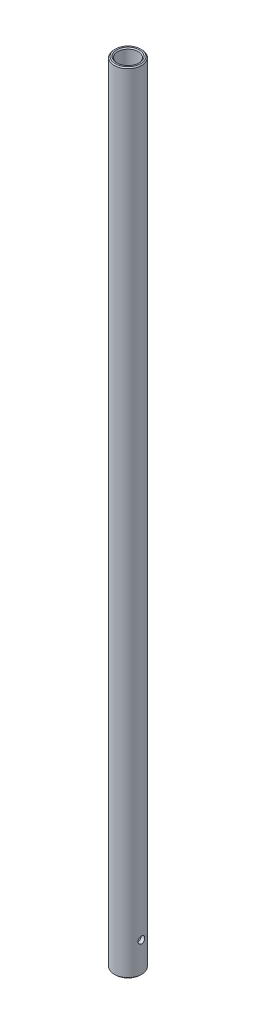
ISO-10303-21;
HEADER;
FILE_DESCRIPTION(('STEP AP214'),'2;1');
FILE_NAME('part.step','',(''),(''),'','','');
FILE_SCHEMA(('AUTOMOTIVE_DESIGN { 1 0 10303 214 1 1 1 1 }'));
ENDSEC;
DATA;
#1=APPLICATION_CONTEXT('core data for automotive mechanical design processes');
#2=APPLICATION_PROTOCOL_DEFINITION('international standard','automotive_design',2000,#1);
#3=PRODUCT_CONTEXT('',#1,'mechanical');
#4=PRODUCT('Part','Part','',(#3));
#5=PRODUCT_RELATED_PRODUCT_CATEGORY('part','',(#4));
#6=PRODUCT_DEFINITION_FORMATION('','',#4);
#7=PRODUCT_DEFINITION_CONTEXT('part definition',#1,'design');
#8=PRODUCT_DEFINITION('design','',#6,#7);
#9=PRODUCT_DEFINITION_SHAPE('','',#8);
#10=(LENGTH_UNIT() NAMED_UNIT(*) SI_UNIT(.MILLI.,.METRE.));
#11=(NAMED_UNIT(*) PLANE_ANGLE_UNIT() SI_UNIT($,.RADIAN.));
#12=(NAMED_UNIT(*) SI_UNIT($,.STERADIAN.) SOLID_ANGLE_UNIT());
#13=UNCERTAINTY_MEASURE_WITH_UNIT(LENGTH_MEASURE(1.E-05),#10,'distance_accuracy_value','');
#14=(GEOMETRIC_REPRESENTATION_CONTEXT(3) GLOBAL_UNCERTAINTY_ASSIGNED_CONTEXT((#13)) GLOBAL_UNIT_ASSIGNED_CONTEXT((#10,
#11,#12)) REPRESENTATION_CONTEXT('',''));
#15=CARTESIAN_POINT('',(0.,0.,0.));
#16=DIRECTION('',(0.,0.,1.));
#17=DIRECTION('',(1.,0.,0.));
#18=AXIS2_PLACEMENT_3D('',#15,#16,#17);
#19=CARTESIAN_POINT('',(0.,230.,0.));
#20=DIRECTION('',(0.,1.,0.));
#21=DIRECTION('',(0.,0.,1.));
#22=AXIS2_PLACEMENT_3D('',#19,#20,#21);
#23=PLANE('',#22);
#24=CARTESIAN_POINT('',(0.,230.,0.));
#25=DIRECTION('',(0.,1.,0.));
#26=DIRECTION('',(0.,0.,1.));
#27=AXIS2_PLACEMENT_3D('',#24,#25,#26);
#28=CIRCLE('',#27,3.29999999999997);
#29=CARTESIAN_POINT('',(0.,230.,3.29999999999997));
#30=VERTEX_POINT('',#29);
#31=EDGE_CURVE('E132',#30,#30,#28,.F.);
#32=ORIENTED_EDGE('',*,*,#31,.T.);
#33=EDGE_LOOP('',(#32));
#34=FACE_BOUND('',#33,.T.);
#35=CARTESIAN_POINT('',(0.,230.,0.));
#36=DIRECTION('',(0.,1.,0.));
#37=DIRECTION('',(0.,0.,1.));
#38=AXIS2_PLACEMENT_3D('',#35,#36,#37);
#39=CIRCLE('',#38,3.70000000000001);
#40=CARTESIAN_POINT('',(0.,230.,3.70000000000001));
#41=VERTEX_POINT('',#40);
#42=EDGE_CURVE('E135',#41,#41,#39,.T.);
#43=ORIENTED_EDGE('',*,*,#42,.T.);
#44=EDGE_LOOP('',(#43));
#45=FACE_BOUND('',#44,.T.);
#46=ADVANCED_FACE('F39',(#34,#45),#23,.T.);
#47=CARTESIAN_POINT('',(0.,0.,0.));
#48=DIRECTION('',(0.,1.,0.));
#49=DIRECTION('',(0.,0.,1.));
#50=AXIS2_PLACEMENT_3D('',#47,#48,#49);
#51=PLANE('',#50);
#52=CARTESIAN_POINT('',(0.,0.,0.));
#53=DIRECTION('',(0.,1.,0.));
#54=DIRECTION('',(0.,0.,1.));
#55=AXIS2_PLACEMENT_3D('',#52,#53,#54);
#56=CIRCLE('',#55,3.30000000000003);
#57=CARTESIAN_POINT('',(0.,0.,3.30000000000003));
#58=VERTEX_POINT('',#57);
#59=EDGE_CURVE('E58',#58,#58,#56,.T.);
#60=ORIENTED_EDGE('',*,*,#59,.T.);
#61=EDGE_LOOP('',(#60));
#62=FACE_BOUND('',#61,.T.);
#63=CARTESIAN_POINT('',(0.,0.,0.));
#64=DIRECTION('',(0.,1.,0.));
#65=DIRECTION('',(0.,0.,1.));
#66=AXIS2_PLACEMENT_3D('',#63,#64,#65);
#67=CIRCLE('',#66,3.70000000000001);
#68=CARTESIAN_POINT('',(0.,0.,3.70000000000001));
#69=VERTEX_POINT('',#68);
#70=EDGE_CURVE('E139',#69,#69,#67,.F.);
#71=ORIENTED_EDGE('',*,*,#70,.T.);
#72=EDGE_LOOP('',(#71));
#73=FACE_BOUND('',#72,.T.);
#74=ADVANCED_FACE('F95',(#62,#73),#51,.F.);
#75=CARTESIAN_POINT('',(0.,230.,0.));
#76=DIRECTION('',(0.,-1.,0.));
#77=DIRECTION('',(0.,0.,-1.));
#78=AXIS2_PLACEMENT_3D('',#75,#76,#77);
#79=CYLINDRICAL_SURFACE('',#78,4.);
#80=CARTESIAN_POINT('',(-4.,8.00000000000002,0.));
#81=CARTESIAN_POINT('',(-3.99999906578675,8.00000155049213,-0.055250725779821));
#82=CARTESIAN_POINT('',(-3.99884385421219,8.00459436718255,-0.110518771887176));
#83=CARTESIAN_POINT('',(-3.99434742553262,8.02281676753803,-0.219470882513688));
#84=CARTESIAN_POINT('',(-3.99100496946646,8.03645147302526,-0.273154031247159));
#85=CARTESIAN_POINT('',(-3.98250417554693,8.07229283564142,-0.377347248121717));
#86=CARTESIAN_POINT('',(-3.97734801894725,8.09448919914355,-0.427861042286668));
#87=CARTESIAN_POINT('',(-3.96576895871729,8.14678759336326,-0.524448087936282));
#88=CARTESIAN_POINT('',(-3.95934601236034,8.17688989074599,-0.570521189565836));
#89=CARTESIAN_POINT('',(-3.94578275727868,8.24480052643618,-0.65786795153394));
#90=CARTESIAN_POINT('',(-3.93863138099022,8.28274104997282,-0.699037126707374));
#91=CARTESIAN_POINT('',(-3.92449080078353,8.36496813660599,-0.774499284802193));
#92=CARTESIAN_POINT('',(-3.91750161525566,8.40925541529771,-0.808791491299412));
#93=CARTESIAN_POINT('',(-3.9043651713314,8.50373015115834,-0.870017695199341));
#94=CARTESIAN_POINT('',(-3.89823196313737,8.55399548720698,-0.89683481061689));
#95=CARTESIAN_POINT('',(-3.88766329874816,8.65849894110562,-0.941597939033667));
#96=CARTESIAN_POINT('',(-3.88322757115193,8.71273642221722,-0.959545370292869));
#97=CARTESIAN_POINT('',(-3.87666984478368,8.82249566546837,-0.98570322453617));
#98=CARTESIAN_POINT('',(-3.87450327383618,8.87796993069992,-0.994101512222201));
#99=CARTESIAN_POINT('',(-3.87259575025161,8.98957904600937,-1.00150785004521));
#100=CARTESIAN_POINT('',(-3.87285440299097,9.04571378713246,-1.00051742787862));
#101=CARTESIAN_POINT('',(-3.87572803664413,9.15561053849637,-0.989324349759487));
#102=CARTESIAN_POINT('',(-3.87828575334587,9.20939708097678,-0.979345560126978));
#103=CARTESIAN_POINT('',(-3.8853780645099,9.31450736727424,-0.950816124602033));
#104=CARTESIAN_POINT('',(-3.88991279980465,9.3658309353527,-0.932264868046242));
#105=CARTESIAN_POINT('',(-3.90050075936125,9.46515867750142,-0.886926318624726));
#106=CARTESIAN_POINT('',(-3.90656884979615,9.51312411452641,-0.860057778155229));
#107=CARTESIAN_POINT('',(-3.91953140564258,9.6039458065046,-0.798904184009921));
#108=CARTESIAN_POINT('',(-3.92642601556491,9.64680116537821,-0.764617832539176));
#109=CARTESIAN_POINT('',(-3.94050587026522,9.72746907712964,-0.688442283120759));
#110=CARTESIAN_POINT('',(-3.94769379651982,9.76510299337427,-0.646364172110519));
#111=CARTESIAN_POINT('',(-3.96137310385858,9.83281416164264,-0.55640794500241));
#112=CARTESIAN_POINT('',(-3.96786446366278,9.86289118284241,-0.508529651805238));
#113=CARTESIAN_POINT('',(-3.97945154729455,9.91470039081629,-0.408077259120868));
#114=CARTESIAN_POINT('',(-3.98454240085151,9.93640356016965,-0.355487595472355));
#115=CARTESIAN_POINT('',(-3.99271944660946,9.97061153713974,-0.247250672095193));
#116=CARTESIAN_POINT('',(-3.99580602226187,9.98311810427878,-0.191603999433594));
#117=CARTESIAN_POINT('',(-3.9995699951425,9.99830504370591,-0.0803599802599558));
#118=CARTESIAN_POINT('',(-4.00030702338852,10.0012286840502,-0.0247978133254114));
#119=CARTESIAN_POINT('',(-3.999458698763,9.99783399862969,0.0860219165343996));
#120=CARTESIAN_POINT('',(-3.99787355494564,9.99151650480059,0.14127950642979));
#121=CARTESIAN_POINT('',(-3.99259720751571,9.97001939440576,0.249076179184387));
#122=CARTESIAN_POINT('',(-3.98893756123874,9.95497249101535,0.301643412645895));
#123=CARTESIAN_POINT('',(-3.97992471089422,9.91659527731438,0.403504861635065));
#124=CARTESIAN_POINT('',(-3.97457133579928,9.89326413045789,0.452798746021813));
#125=CARTESIAN_POINT('',(-3.96262205284206,9.83850924741685,0.547682089619953));
#126=CARTESIAN_POINT('',(-3.95600578244621,9.80694925840216,0.593190294557274));
#127=CARTESIAN_POINT('',(-3.94229672791612,9.73680672746868,0.678351075762217));
#128=CARTESIAN_POINT('',(-3.93520386167802,9.69822297358873,0.71800263931539));
#129=CARTESIAN_POINT('',(-3.92112637973846,9.61399869277035,0.791327045381869));
#130=CARTESIAN_POINT('',(-3.91414869458186,9.56820819799838,0.824829245081401));
#131=CARTESIAN_POINT('',(-3.90128585584825,9.47151157702285,0.883673839341842));
#132=CARTESIAN_POINT('',(-3.89540065378016,9.42060567802682,0.909016596105334));
#133=CARTESIAN_POINT('',(-3.88545396489776,9.31539618505794,0.950634280406234));
#134=CARTESIAN_POINT('',(-3.88138170194603,9.26111491443732,0.966962931102748));
#135=CARTESIAN_POINT('',(-3.87551162726788,9.15046024140725,0.99023043996922));
#136=CARTESIAN_POINT('',(-3.8737133181329,9.09408729931166,0.997171351652471));
#137=CARTESIAN_POINT('',(-3.87263267469304,8.98258598409652,1.00135906022269));
#138=CARTESIAN_POINT('',(-3.87327955152175,8.9274683765835,0.998878598520106));
#139=CARTESIAN_POINT('',(-3.87685272671894,8.81846407422133,0.984918185541936));
#140=CARTESIAN_POINT('',(-3.87977897927904,8.76457735465755,0.973438415124535));
#141=CARTESIAN_POINT('',(-3.88754173788481,8.65986102728972,0.941954212961882));
#142=CARTESIAN_POINT('',(-3.89236676824206,8.60901512983985,0.922000936453602));
#143=CARTESIAN_POINT('',(-3.90338503816552,8.5113564115242,0.874176609070063));
#144=CARTESIAN_POINT('',(-3.90957846747182,8.46454415120871,0.846304460022806));
#145=CARTESIAN_POINT('',(-3.92283756175675,8.37496358066531,0.782578499091435));
#146=CARTESIAN_POINT('',(-3.92992176554505,8.33233261771736,0.746535441941512));
#147=CARTESIAN_POINT('',(-3.94405351497524,8.25363530346972,0.667859580793163));
#148=CARTESIAN_POINT('',(-3.95110105151373,8.21757051325802,0.625225214174102));
#149=CARTESIAN_POINT('',(-3.96451770431775,8.15239246095693,0.533645057801729));
#150=CARTESIAN_POINT('',(-3.97087222243912,8.12341692421895,0.484598948210926));
#151=CARTESIAN_POINT('',(-3.98203283316746,8.07416835803965,0.382177373006984));
#152=CARTESIAN_POINT('',(-3.98684003466521,8.05388909290098,0.328805042291159));
#153=CARTESIAN_POINT('',(-3.99365373043694,8.02561877978024,0.229606835495647));
#154=CARTESIAN_POINT('',(-3.9960172336846,8.01603250463106,0.184253447272045));
#155=CARTESIAN_POINT('',(-3.99919070154632,8.00322270425205,0.0926040476908549));
#156=CARTESIAN_POINT('',(-4.00000078300596,7.99999870046315,0.0463081074950772));
#157=CARTESIAN_POINT('',(-4.,8.00000000000002,0.));
#158=B_SPLINE_CURVE_WITH_KNOTS('',3,(#80,#81,#82,#83,#84,#85,#86,#87,#88,#89,#90,#91,#92,#93,
#94,#95,#96,#97,#98,#99,#100,#101,#102,#103,#104,#105,#106,#107,#108,#109,#110,#111,#112,#113,
#114,#115,#116,#117,#118,#119,#120,#121,#122,#123,#124,#125,#126,#127,#128,#129,#130,#131,#132,
#133,#134,#135,#136,#137,#138,#139,#140,#141,#142,#143,#144,#145,#146,#147,#148,#149,#150,#151,
#152,#153,#154,#155,#156,#157),.UNSPECIFIED.,.T.,.F.,(4,2,2,2,2,2,2,2,2,2,2,2,2,2,2,2,2,2,2,2,2,
2,2,2,2,2,2,2,2,2,2,2,2,2,2,2,2,2,4),(0.,0.16558247498126,0.331258825175934,0.496736601524072,
0.662219960112887,0.830762902914261,0.999324863867081,1.17039098363871,1.34142974112913,
1.50904196732954,1.67662692075131,1.84014998004679,2.00368468977359,2.16887018582586,
2.33408460557442,2.50401000646014,2.67394059705498,2.84445486006077,3.01493649125762,
3.18105539299518,3.34715934075162,3.51080183009358,3.67446084881527,3.84102391710235,
4.0076157533868,4.17829672802984,4.34897012499672,4.51861503076024,4.68822282168272,
4.85295853599075,5.0176909397069,5.18144267039632,5.34521712091268,5.51326384273274,
5.68135046513612,5.85248123666392,6.02348909214234,6.16228161961433,6.3010637069536),.UNSPECIFIED.);
#159=CARTESIAN_POINT('',(-4.,8.00000000000002,0.));
#160=VERTEX_POINT('',#159);
#161=EDGE_CURVE('E85',#160,#160,#158,.T.);
#162=ORIENTED_EDGE('',*,*,#161,.T.);
#163=EDGE_LOOP('',(#162));
#164=FACE_BOUND('',#163,.T.);
#165=CARTESIAN_POINT('',(3.87298334620742,9.00000000000002,-0.999999999999972));
#166=CARTESIAN_POINT('',(3.87298440057186,8.94477969964323,-0.999998431438671));
#167=CARTESIAN_POINT('',(3.87417722499279,8.88954204056866,-0.995410498208041));
#168=CARTESIAN_POINT('',(3.8788074489225,8.78065296876741,-0.977209250194418));
#169=CARTESIAN_POINT('',(3.88224615474181,8.72700249822005,-0.963590682698049));
#170=CARTESIAN_POINT('',(3.89095489813013,8.62287858471218,-0.927796479849606));
#171=CARTESIAN_POINT('',(3.8962225706936,8.57240113784226,-0.905631891140915));
#172=CARTESIAN_POINT('',(3.90799276818328,8.47587565898754,-0.853408456505378));
#173=CARTESIAN_POINT('',(3.91449534553241,8.42982781516887,-0.823349275424476));
#174=CARTESIAN_POINT('',(3.92816286540369,8.34245534189417,-0.755483370924489));
#175=CARTESIAN_POINT('',(3.9353383904871,8.30124255985974,-0.717534755081529));
#176=CARTESIAN_POINT('',(3.94945150206622,8.22569544225614,-0.635272825640299));
#177=CARTESIAN_POINT('',(3.95638906626692,8.19136174975139,-0.59095891767211));
#178=CARTESIAN_POINT('',(3.96936166208095,8.13008981294744,-0.496458080431535));
#179=CARTESIAN_POINT('',(3.975382749602,8.10326144473541,-0.446197830478014));
#180=CARTESIAN_POINT('',(3.98572324770431,8.0584761423388,-0.34170527371708));
#181=CARTESIAN_POINT('',(3.99004290933748,8.04051789923382,-0.287473554316748));
#182=CARTESIAN_POINT('',(3.99641903539263,8.01434086616858,-0.177743503501634));
#183=CARTESIAN_POINT('',(3.99851957537723,8.00593214226938,-0.12229308781956));
#184=CARTESIAN_POINT('',(4.00037437642922,7.9984966482898,-0.0107315277050783));
#185=CARTESIAN_POINT('',(4.00012898438682,7.99946849111618,0.0453795178152572));
#186=CARTESIAN_POINT('',(3.99735237981413,8.01062994010007,0.155352247172417));
#187=CARTESIAN_POINT('',(3.99487200936349,8.02061453002156,0.209236215601097));
#188=CARTESIAN_POINT('',(3.98796334609942,8.04918850801942,0.314538247413716));
#189=CARTESIAN_POINT('',(3.98353494959376,8.06777835415098,0.365956179370468));
#190=CARTESIAN_POINT('',(3.97315003880358,8.11320102827484,0.465406703501837));
#191=CARTESIAN_POINT('',(3.96718007878021,8.14010681786472,0.513404509766535));
#192=CARTESIAN_POINT('',(3.95435961523859,8.20134227164652,0.604275622340519));
#193=CARTESIAN_POINT('',(3.94750895860995,8.23567322742427,0.647148035085536));
#194=CARTESIAN_POINT('',(3.93345485507808,8.31188349679297,0.727774035084986));
#195=CARTESIAN_POINT('',(3.92624687810367,8.35394195693913,0.76535767907523));
#196=CARTESIAN_POINT('',(3.91246017406682,8.44383998941612,0.832976375963049));
#197=CARTESIAN_POINT('',(3.90588147642387,8.49167983179642,0.863011076046047));
#198=CARTESIAN_POINT('',(3.89408198732659,8.59211601365961,0.914788129022628));
#199=CARTESIAN_POINT('',(3.88886793490287,8.6447342921253,0.936489566970521));
#200=CARTESIAN_POINT('',(3.88047456055982,8.7530341872306,0.970685620636371));
#201=CARTESIAN_POINT('',(3.87729480324087,8.80871514559327,0.98318220655294));
#202=CARTESIAN_POINT('',(3.87342142415656,8.91998380060927,0.998331855466101));
#203=CARTESIAN_POINT('',(3.87266435637458,8.97553511733187,1.00123618956788));
#204=CARTESIAN_POINT('',(3.87354937392415,9.08632877463128,0.997806796206249));
#205=CARTESIAN_POINT('',(3.87519123840506,9.14157114318051,0.99147391913955));
#206=CARTESIAN_POINT('',(3.88062832781823,9.2492457059819,0.969970185575095));
#207=CARTESIAN_POINT('',(3.88438788093749,9.30170909062836,0.954945627312728));
#208=CARTESIAN_POINT('',(3.89360287308384,9.40337258314069,0.916647232668279));
#209=CARTESIAN_POINT('',(3.89905851299445,9.45257230362215,0.893372419085048));
#210=CARTESIAN_POINT('',(3.91118454837304,9.54737651114696,0.838708267174654));
#211=CARTESIAN_POINT('',(3.91787667442656,9.59289153601726,0.807168701534283));
#212=CARTESIAN_POINT('',(3.93166833228686,9.67807534512056,0.737060292934487));
#213=CARTESIAN_POINT('',(3.93876793091388,9.71774316666005,0.69849029480547));
#214=CARTESIAN_POINT('',(3.95278961212642,9.7911244170284,0.614262720984756));
#215=CARTESIAN_POINT('',(3.95970280824734,9.82466402501954,0.568451952531623));
#216=CARTESIAN_POINT('',(3.97238886645493,9.88357434678052,0.471702682694705));
#217=CARTESIAN_POINT('',(3.97816178801584,9.9089454866433,0.420764448957621));
#218=CARTESIAN_POINT('',(3.98788046295325,9.95057841381119,0.31555820173112));
#219=CARTESIAN_POINT('',(3.99183932008964,9.96690571375165,0.261317381027911));
#220=CARTESIAN_POINT('',(3.99754117358315,9.99018413384339,0.150749760318837));
#221=CARTESIAN_POINT('',(3.99928459757363,9.99713706349564,0.0944233650412732));
#222=CARTESIAN_POINT('',(4.00034169408811,10.0013675895756,-0.017083526443297));
#223=CARTESIAN_POINT('',(3.99971978880009,9.99890170909541,-0.0722538269660041));
#224=CARTESIAN_POINT('',(3.99625896457424,9.98495217270569,-0.181367496414711));
#225=CARTESIAN_POINT('',(3.99342011157095,9.97346878498692,-0.235310901780857));
#226=CARTESIAN_POINT('',(3.98585432853963,9.94194778022909,-0.340171035644787));
#227=CARTESIAN_POINT('',(3.98113764502669,9.92195654668539,-0.39110249458099));
#228=CARTESIAN_POINT('',(3.97031288913382,9.87402942098069,-0.488917053041439));
#229=CARTESIAN_POINT('',(3.96420464137727,9.84609252733045,-0.535799641265022));
#230=CARTESIAN_POINT('',(3.95107249681343,9.78228476600295,-0.625401928423871));
#231=CARTESIAN_POINT('',(3.94403016945647,9.74623985709265,-0.667994988300558));
#232=CARTESIAN_POINT('',(3.92990649053207,9.66757714802621,-0.746615020271222));
#233=CARTESIAN_POINT('',(3.92282512952424,9.62495768390207,-0.782640325068149));
#234=CARTESIAN_POINT('',(3.90927475860683,9.53339858579873,-0.847762026479211));
#235=CARTESIAN_POINT('',(3.90281963730392,9.48435587658754,-0.876716619446564));
#236=CARTESIAN_POINT('',(3.8914395555011,9.38194451007717,-0.925926896615593));
#237=CARTESIAN_POINT('',(3.88651348244815,9.32857903389273,-0.946188909759528));
#238=CARTESIAN_POINT('',(3.87951908741316,9.22942298817374,-0.974422528565542));
#239=CARTESIAN_POINT('',(3.87708663005762,9.18410683561766,-0.9839931705958));
#240=CARTESIAN_POINT('',(3.87381838580359,9.09253113099855,-0.99678229257279));
#241=CARTESIAN_POINT('',(3.87298246270639,9.04627165974939,-1.00000131437049));
#242=CARTESIAN_POINT('',(3.87298334620742,9.00000000000002,-0.999999999999972));
#243=B_SPLINE_CURVE_WITH_KNOTS('',3,(#165,#166,#167,#168,#169,#170,#171,#172,#173,#174,#175,
#176,#177,#178,#179,#180,#181,#182,#183,#184,#185,#186,#187,#188,#189,#190,#191,#192,#193,#194,
#195,#196,#197,#198,#199,#200,#201,#202,#203,#204,#205,#206,#207,#208,#209,#210,#211,#212,#213,
#214,#215,#216,#217,#218,#219,#220,#221,#222,#223,#224,#225,#226,#227,#228,#229,#230,#231,#232,
#233,#234,#235,#236,#237,#238,#239,#240,#241,#242),.UNSPECIFIED.,.T.,.F.,(4,2,2,2,2,2,2,2,2,2,2,
2,2,2,2,2,2,2,2,2,2,2,2,2,2,2,2,2,2,2,2,2,2,2,2,2,2,2,4),(0.,0.165490976675229,
0.331078296534212,0.496452290829153,0.661833306984658,0.83049581673465,0.999174085882212,
1.17020598555443,1.34121263935111,1.50875500394413,1.67627259462683,1.84007305071853,
2.00388222686189,2.16917149698053,2.3344895418384,2.50428186625039,2.67408212476196,
2.84470572799636,3.01529280048094,3.18137429900961,3.34744050869796,3.51078961999957,
3.67415808564842,3.84073138339938,4.00733207550293,4.17810132382403,4.34886166284096,
4.51836829119047,4.6878421955989,4.85273378447258,5.01762046947067,5.18161950620159,
5.34563922291504,5.51358838629103,5.68158012622478,5.85270590910146,6.02370688542923,
6.16239130867207,6.30106390036083),.UNSPECIFIED.);
#244=CARTESIAN_POINT('',(3.87298334620742,9.00000000000002,-0.999999999999972));
#245=VERTEX_POINT('',#244);
#246=EDGE_CURVE('E79',#245,#245,#243,.T.);
#247=ORIENTED_EDGE('',*,*,#246,.T.);
#248=EDGE_LOOP('',(#247));
#249=FACE_BOUND('',#248,.T.);
#250=CARTESIAN_POINT('',(0.,0.299999999999967,0.));
#251=DIRECTION('',(0.,1.,0.));
#252=DIRECTION('',(0.,0.,1.));
#253=AXIS2_PLACEMENT_3D('',#250,#251,#252);
#254=CIRCLE('',#253,4.);
#255=CARTESIAN_POINT('',(0.,0.299999999999967,4.));
#256=VERTEX_POINT('',#255);
#257=EDGE_CURVE('E10',#256,#256,#254,.T.);
#258=ORIENTED_EDGE('',*,*,#257,.T.);
#259=EDGE_LOOP('',(#258));
#260=FACE_BOUND('',#259,.T.);
#261=CARTESIAN_POINT('',(0.,229.7,0.));
#262=DIRECTION('',(0.,1.,0.));
#263=DIRECTION('',(0.,0.,1.));
#264=AXIS2_PLACEMENT_3D('',#261,#262,#263);
#265=CIRCLE('',#264,4.);
#266=CARTESIAN_POINT('',(0.,229.7,4.));
#267=VERTEX_POINT('',#266);
#268=EDGE_CURVE('E53',#267,#267,#265,.F.);
#269=ORIENTED_EDGE('',*,*,#268,.T.);
#270=EDGE_LOOP('',(#269));
#271=FACE_BOUND('',#270,.T.);
#272=ADVANCED_FACE('F90',(#164,#249,#260,#271),#79,.T.);
#273=CARTESIAN_POINT('',(0.,230.,0.));
#274=DIRECTION('',(0.,-1.,0.));
#275=DIRECTION('',(0.,0.,-1.));
#276=AXIS2_PLACEMENT_3D('',#273,#274,#275);
#277=CYLINDRICAL_SURFACE('',#276,3.);
#278=CARTESIAN_POINT('',(-2.8284271247462,9.00000000000002,-0.999999999999972));
#279=CARTESIAN_POINT('',(-2.82842694532736,9.0544681748107,-1.00000025794777));
#280=CARTESIAN_POINT('',(-2.83001769372807,9.10893479977154,-0.995534783698112));
#281=CARTESIAN_POINT('',(-2.83617574174581,9.21625442095064,-0.977851131702535));
#282=CARTESIAN_POINT('',(-2.84074353167221,9.26910714986396,-0.964631512170644));
#283=CARTESIAN_POINT('',(-2.85228203663889,9.37162689301283,-0.929955485680233));
#284=CARTESIAN_POINT('',(-2.85924803964641,9.4212999294469,-0.908515221401971));
#285=CARTESIAN_POINT('',(-2.87479122017008,9.51636004854381,-0.858061628442598));
#286=CARTESIAN_POINT('',(-2.88336875305433,9.56174618255252,-0.829046628860493));
#287=CARTESIAN_POINT('',(-2.9015448940559,9.64871996233951,-0.763051146442497));
#288=CARTESIAN_POINT('',(-2.91116894844139,9.69011542867206,-0.725824341377795));
#289=CARTESIAN_POINT('',(-2.93013864801509,9.76620680122434,-0.644987667214459));
#290=CARTESIAN_POINT('',(-2.93948424829099,9.8009016315823,-0.60137677505237));
#291=CARTESIAN_POINT('',(-2.95713866921659,9.8634788973297,-0.507604507964952));
#292=CARTESIAN_POINT('',(-2.96541407701568,9.891159970618,-0.457301911224487));
#293=CARTESIAN_POINT('',(-2.97969586771021,9.93759158512751,-0.352431222987451));
#294=CARTESIAN_POINT('',(-2.98570286203012,9.95634453317692,-0.297864285687184));
#295=CARTESIAN_POINT('',(-2.99459075431898,9.98373585463242,-0.188028817433462));
#296=CARTESIAN_POINT('',(-2.99757314777558,9.99270344625703,-0.132850754852936));
#297=CARTESIAN_POINT('',(-3.00043608218249,10.0013162933607,-0.0216978748240601));
#298=CARTESIAN_POINT('',(-3.00031742262891,10.0009639516524,0.0342767335439239));
#299=CARTESIAN_POINT('',(-2.99706039618735,9.99115574543399,0.143103515193848));
#300=CARTESIAN_POINT('',(-2.99404064755135,9.98205747152551,0.195992048591698));
#301=CARTESIAN_POINT('',(-2.98546967339714,9.95560701901957,0.299443438822191));
#302=CARTESIAN_POINT('',(-2.97991827631115,9.93825428102026,0.350006137779206));
#303=CARTESIAN_POINT('',(-2.96675670293291,9.89557868269389,0.448152474842044));
#304=CARTESIAN_POINT('',(-2.95912042524269,9.87015406145324,0.495688220969029));
#305=CARTESIAN_POINT('',(-2.94258393038664,9.81214029455163,0.5859243255272));
#306=CARTESIAN_POINT('',(-2.93368336200517,9.77954915667338,0.6286233343848));
#307=CARTESIAN_POINT('',(-2.91506191850889,9.70632560653928,0.710100866551937));
#308=CARTESIAN_POINT('',(-2.90532215172666,9.66538684215458,0.748600157067586));
#309=CARTESIAN_POINT('',(-2.8864733524511,9.57755127427736,0.81827725959592));
#310=CARTESIAN_POINT('',(-2.87736441731449,9.53065355428678,0.849453943273035));
#311=CARTESIAN_POINT('',(-2.8607052513553,9.4313463743846,0.903987455042762));
#312=CARTESIAN_POINT('',(-2.8531790933882,9.37886786863221,0.927226463651079));
#313=CARTESIAN_POINT('',(-2.84081650878298,9.27042860573376,0.964443193299537));
#314=CARTESIAN_POINT('',(-2.83597895501222,9.21446931877819,0.97842479575556));
#315=CARTESIAN_POINT('',(-2.82979636302069,9.1033616445994,0.996161282090505));
#316=CARTESIAN_POINT('',(-2.82830360315138,9.04829057525429,1.00034909550578));
#317=CARTESIAN_POINT('',(-2.82856672062799,8.93822385088298,0.999605438911634));
#318=CARTESIAN_POINT('',(-2.83032200792767,8.88322818397526,0.99467562522729));
#319=CARTESIAN_POINT('',(-2.83673618089378,8.77684303428885,0.97622565155186));
#320=CARTESIAN_POINT('',(-2.84129325440592,8.72539456984938,0.963006393980585));
#321=CARTESIAN_POINT('',(-2.85268553671269,8.62545639376063,0.928713862560626));
#322=CARTESIAN_POINT('',(-2.85952114934906,8.57696720840918,0.907639196363488));
#323=CARTESIAN_POINT('',(-2.87496877595717,8.48261957915308,0.857474340738932));
#324=CARTESIAN_POINT('',(-2.88363025665609,8.43689335735823,0.828151118358518));
#325=CARTESIAN_POINT('',(-2.90165768730983,8.35085394761628,0.762585630557599));
#326=CARTESIAN_POINT('',(-2.91102384443799,8.3105423613388,0.726341325498815));
#327=CARTESIAN_POINT('',(-2.92995038637843,8.23447201590938,0.645891705900352));
#328=CARTESIAN_POINT('',(-2.93949843577895,8.19902560998117,0.601387270546682));
#329=CARTESIAN_POINT('',(-2.9572685161311,8.13608385765197,0.506827291400288));
#330=CARTESIAN_POINT('',(-2.96549059417695,8.1085882288376,0.456771944864583));
#331=CARTESIAN_POINT('',(-2.97964405810602,8.0625798951383,0.352779862432326));
#332=CARTESIAN_POINT('',(-2.98559030004531,8.04400872285195,0.298871123321226));
#333=CARTESIAN_POINT('',(-2.99458610837774,8.01627225793991,0.188458465846046));
#334=CARTESIAN_POINT('',(-2.99763672034018,8.00710357011951,0.131955491953918));
#335=CARTESIAN_POINT('',(-3.00041863236257,7.99873792239438,0.020815335860069));
#336=CARTESIAN_POINT('',(-3.00029920089442,7.99909254606764,-0.0337847239199906));
#337=CARTESIAN_POINT('',(-2.99712196519396,8.00865730814643,-0.142111145000145));
#338=CARTESIAN_POINT('',(-2.99406439933568,8.01786672815278,-0.195837576819027));
#339=CARTESIAN_POINT('',(-2.98540914954421,8.04458223457599,-0.300042119432032));
#340=CARTESIAN_POINT('',(-2.9798525836118,8.06195421535297,-0.350558270912767));
#341=CARTESIAN_POINT('',(-2.96677160704464,8.10437753109716,-0.447978350939761));
#342=CARTESIAN_POINT('',(-2.95924684047901,8.12943025519696,-0.494881624142381));
#343=CARTESIAN_POINT('',(-2.94265868828001,8.1875695121021,-0.585634016308781));
#344=CARTESIAN_POINT('',(-2.93354872492382,8.22091868538194,-0.629306251557668));
#345=CARTESIAN_POINT('',(-2.91492988791425,8.29425739115593,-0.71058102627231));
#346=CARTESIAN_POINT('',(-2.90542088771398,8.3342490422617,-0.748181621624231));
#347=CARTESIAN_POINT('',(-2.88663279827366,8.42160935558805,-0.817741808833436));
#348=CARTESIAN_POINT('',(-2.87737727995345,8.46920551098079,-0.849422965999189));
#349=CARTESIAN_POINT('',(-2.86060193316304,8.56933442689867,-0.904314343299771));
#350=CARTESIAN_POINT('',(-2.85308165136171,8.62186589301426,-0.927526776814531));
#351=CARTESIAN_POINT('',(-2.84101334230536,8.72796182402385,-0.963843828206598));
#352=CARTESIAN_POINT('',(-2.836346329448,8.78137226356574,-0.97735790916324));
#353=CARTESIAN_POINT('',(-2.83005383613941,8.8898560505155,-0.995434320161666));
#354=CARTESIAN_POINT('',(-2.82842730615136,8.94492881743577,-0.999999739196473));
#355=CARTESIAN_POINT('',(-2.8284271247462,9.00000000000002,-0.999999999999972));
#356=B_SPLINE_CURVE_WITH_KNOTS('',3,(#278,#279,#280,#281,#282,#283,#284,#285,#286,#287,#288,
#289,#290,#291,#292,#293,#294,#295,#296,#297,#298,#299,#300,#301,#302,#303,#304,#305,#306,#307,
#308,#309,#310,#311,#312,#313,#314,#315,#316,#317,#318,#319,#320,#321,#322,#323,#324,#325,#326,
#327,#328,#329,#330,#331,#332,#333,#334,#335,#336,#337,#338,#339,#340,#341,#342,#343,#344,#345,
#346,#347,#348,#349,#350,#351,#352,#353,#354,#355),.UNSPECIFIED.,.T.,.F.,(4,2,2,2,2,2,2,2,2,2,2,
2,2,2,2,2,2,2,2,2,2,2,2,2,2,2,2,2,2,2,2,2,2,2,2,2,2,2,4),(0.,0.163200584775419,
0.326428054968882,0.489336627454545,0.65228116613916,0.8210133742294,0.989772651673599,
1.16293506139029,1.33605076382161,1.50314318760306,1.67019253297699,1.83069004820941,
1.99119844184608,2.15381654855707,2.31647991869394,2.48680174359289,2.65714979607478,
2.82992639837376,3.00263051349689,3.16754291357513,3.33242535830307,3.49164395761849,
3.65089079140019,3.81518857728788,3.979534856552,4.15178808164166,4.32403518750605,
4.49513791183925,4.6661788299723,4.82918084670709,4.99216964002855,5.15256956033503,
5.31299850756316,5.47935519513707,5.64576504425705,5.81868902729218,5.9915677825994,
6.15663212153687,6.3216394717923),.UNSPECIFIED.);
#357=CARTESIAN_POINT('',(-2.8284271247462,9.00000000000002,-0.999999999999972));
#358=VERTEX_POINT('',#357);
#359=EDGE_CURVE('E44',#358,#358,#356,.T.);
#360=ORIENTED_EDGE('',*,*,#359,.F.);
#361=EDGE_LOOP('',(#360));
#362=FACE_BOUND('',#361,.T.);
#363=CARTESIAN_POINT('',(2.8284271247462,9.00000000000002,-0.999999999999972));
#364=CARTESIAN_POINT('',(2.82842694532736,8.94553182518934,-1.00000025794777));
#365=CARTESIAN_POINT('',(2.83001769372807,8.89106520022849,-0.995534783698112));
#366=CARTESIAN_POINT('',(2.83617574174581,8.7837455790494,-0.977851131702535));
#367=CARTESIAN_POINT('',(2.84074353167221,8.73089285013608,-0.964631512170644));
#368=CARTESIAN_POINT('',(2.85228203663889,8.6283731069872,-0.929955485680233));
#369=CARTESIAN_POINT('',(2.85924803964641,8.57870007055313,-0.908515221401971));
#370=CARTESIAN_POINT('',(2.87479122017008,8.48363995145622,-0.858061628442598));
#371=CARTESIAN_POINT('',(2.88336875305433,8.43825381744752,-0.829046628860493));
#372=CARTESIAN_POINT('',(2.9015448940559,8.35128003766053,-0.763051146442497));
#373=CARTESIAN_POINT('',(2.91116894844139,8.30988457132797,-0.725824341377795));
#374=CARTESIAN_POINT('',(2.93013864801509,8.23379319877569,-0.644987667214459));
#375=CARTESIAN_POINT('',(2.93948424829099,8.19909836841773,-0.60137677505237));
#376=CARTESIAN_POINT('',(2.95713866921659,8.13652110267034,-0.507604507964952));
#377=CARTESIAN_POINT('',(2.96541407701568,8.10884002938204,-0.457301911224487));
#378=CARTESIAN_POINT('',(2.97969586771021,8.06240841487253,-0.352431222987451));
#379=CARTESIAN_POINT('',(2.98570286203012,8.04365546682312,-0.297864285687184));
#380=CARTESIAN_POINT('',(2.99459075431898,8.01626414536762,-0.188028817433462));
#381=CARTESIAN_POINT('',(2.99757314777558,8.00729655374301,-0.132850754852936));
#382=CARTESIAN_POINT('',(3.00043608218249,7.99868370663936,-0.0216978748240601));
#383=CARTESIAN_POINT('',(3.00031742262891,7.9990360483476,0.0342767335439239));
#384=CARTESIAN_POINT('',(2.99706039618735,8.00884425456605,0.143103515193848));
#385=CARTESIAN_POINT('',(2.99404064755135,8.01794252847452,0.195992048591698));
#386=CARTESIAN_POINT('',(2.98546967339714,8.04439298098047,0.299443438822191));
#387=CARTESIAN_POINT('',(2.97991827631115,8.06174571897977,0.350006137779206));
#388=CARTESIAN_POINT('',(2.96675670293291,8.10442131730615,0.448152474842044));
#389=CARTESIAN_POINT('',(2.95912042524269,8.1298459385468,0.495688220969029));
#390=CARTESIAN_POINT('',(2.94258393038664,8.18785970544841,0.5859243255272));
#391=CARTESIAN_POINT('',(2.93368336200517,8.22045084332666,0.6286233343848));
#392=CARTESIAN_POINT('',(2.91506191850889,8.29367439346075,0.710100866551937));
#393=CARTESIAN_POINT('',(2.90532215172666,8.33461315784546,0.748600157067586));
#394=CARTESIAN_POINT('',(2.8864733524511,8.42244872572268,0.81827725959592));
#395=CARTESIAN_POINT('',(2.87736441731449,8.46934644571325,0.849453943273035));
#396=CARTESIAN_POINT('',(2.8607052513553,8.56865362561543,0.903987455042763));
#397=CARTESIAN_POINT('',(2.8531790933882,8.62113213136783,0.92722646365108));
#398=CARTESIAN_POINT('',(2.84081650878298,8.72957139426628,0.964443193299537));
#399=CARTESIAN_POINT('',(2.83597895501222,8.78553068122185,0.97842479575556));
#400=CARTESIAN_POINT('',(2.82979636302069,8.89663835540064,0.996161282090505));
#401=CARTESIAN_POINT('',(2.82830360315138,8.95170942474574,1.00034909550578));
#402=CARTESIAN_POINT('',(2.82856672062799,9.06177614911706,0.999605438911634));
#403=CARTESIAN_POINT('',(2.83032200792767,9.11677181602478,0.99467562522729));
#404=CARTESIAN_POINT('',(2.83673618089378,9.22315696571118,0.97622565155186));
#405=CARTESIAN_POINT('',(2.84129325440592,9.27460543015066,0.963006393980585));
#406=CARTESIAN_POINT('',(2.85268553671269,9.3745436062394,0.928713862560626));
#407=CARTESIAN_POINT('',(2.85952114934906,9.42303279159085,0.907639196363488));
#408=CARTESIAN_POINT('',(2.87496877595717,9.51738042084696,0.857474340738932));
#409=CARTESIAN_POINT('',(2.88363025665609,9.5631066426418,0.828151118358518));
#410=CARTESIAN_POINT('',(2.90165768730983,9.64914605238375,0.762585630557599));
#411=CARTESIAN_POINT('',(2.91102384443799,9.68945763866124,0.726341325498815));
#412=CARTESIAN_POINT('',(2.92995038637843,9.76552798409065,0.645891705900352));
#413=CARTESIAN_POINT('',(2.93949843577895,9.80097439001887,0.601387270546682));
#414=CARTESIAN_POINT('',(2.9572685161311,9.86391614234806,0.506827291400288));
#415=CARTESIAN_POINT('',(2.96549059417695,9.89141177116244,0.456771944864583));
#416=CARTESIAN_POINT('',(2.97964405810602,9.93742010486173,0.352779862432326));
#417=CARTESIAN_POINT('',(2.98559030004531,9.95599127714808,0.298871123321226));
#418=CARTESIAN_POINT('',(2.99458610837774,9.98372774206012,0.188458465846046));
#419=CARTESIAN_POINT('',(2.99763672034018,9.99289642988052,0.131955491953918));
#420=CARTESIAN_POINT('',(3.00041863236257,10.0012620776057,0.020815335860069));
#421=CARTESIAN_POINT('',(3.00029920089442,10.0009074539324,-0.0337847239199906));
#422=CARTESIAN_POINT('',(2.99712196519396,9.99134269185361,-0.142111145000145));
#423=CARTESIAN_POINT('',(2.99406439933568,9.98213327184726,-0.195837576819027));
#424=CARTESIAN_POINT('',(2.98540914954421,9.95541776542405,-0.300042119432032));
#425=CARTESIAN_POINT('',(2.9798525836118,9.93804578464707,-0.350558270912767));
#426=CARTESIAN_POINT('',(2.96677160704464,9.89562246890288,-0.447978350939762));
#427=CARTESIAN_POINT('',(2.95924684047901,9.87056974480308,-0.494881624142382));
#428=CARTESIAN_POINT('',(2.94265868828001,9.81243048789794,-0.585634016308781));
#429=CARTESIAN_POINT('',(2.93354872492382,9.7790813146181,-0.629306251557668));
#430=CARTESIAN_POINT('',(2.91492988791425,9.7057426088441,-0.71058102627231));
#431=CARTESIAN_POINT('',(2.90542088771398,9.66575095773834,-0.748181621624231));
#432=CARTESIAN_POINT('',(2.88663279827366,9.57839064441198,-0.817741808833436));
#433=CARTESIAN_POINT('',(2.87737727995345,9.53079448901925,-0.849422965999189));
#434=CARTESIAN_POINT('',(2.86060193316304,9.43066557310136,-0.904314343299771));
#435=CARTESIAN_POINT('',(2.85308165136171,9.37813410698577,-0.927526776814531));
#436=CARTESIAN_POINT('',(2.84101334230536,9.27203817597618,-0.963843828206598));
#437=CARTESIAN_POINT('',(2.836346329448,9.2186277364343,-0.977357909163239));
#438=CARTESIAN_POINT('',(2.83005383613941,9.11014394948454,-0.995434320161666));
#439=CARTESIAN_POINT('',(2.82842730615136,9.05507118256427,-0.999999739196473));
#440=CARTESIAN_POINT('',(2.8284271247462,9.00000000000002,-0.999999999999972));
#441=B_SPLINE_CURVE_WITH_KNOTS('',3,(#363,#364,#365,#366,#367,#368,#369,#370,#371,#372,#373,
#374,#375,#376,#377,#378,#379,#380,#381,#382,#383,#384,#385,#386,#387,#388,#389,#390,#391,#392,
#393,#394,#395,#396,#397,#398,#399,#400,#401,#402,#403,#404,#405,#406,#407,#408,#409,#410,#411,
#412,#413,#414,#415,#416,#417,#418,#419,#420,#421,#422,#423,#424,#425,#426,#427,#428,#429,#430,
#431,#432,#433,#434,#435,#436,#437,#438,#439,#440),.UNSPECIFIED.,.T.,.F.,(4,2,2,2,2,2,2,2,2,2,2,
2,2,2,2,2,2,2,2,2,2,2,2,2,2,2,2,2,2,2,2,2,2,2,2,2,2,2,4),(0.,0.163200584775419,
0.326428054968882,0.489336627454546,0.65228116613916,0.8210133742294,0.989772651673599,
1.16293506139029,1.33605076382161,1.50314318760306,1.67019253297699,1.83069004820941,
1.99119844184608,2.15381654855707,2.31647991869394,2.48680174359289,2.65714979607478,
2.82992639837377,3.00263051349689,3.16754291357513,3.33242535830307,3.49164395761849,
3.65089079140019,3.81518857728788,3.979534856552,4.15178808164166,4.32403518750605,
4.49513791183925,4.6661788299723,4.82918084670709,4.99216964002855,5.15256956033503,
5.31299850756316,5.47935519513707,5.64576504425705,5.81868902729218,5.9915677825994,
6.15663212153686,6.3216394717923),.UNSPECIFIED.);
#442=CARTESIAN_POINT('',(2.8284271247462,9.00000000000002,-0.999999999999972));
#443=VERTEX_POINT('',#442);
#444=EDGE_CURVE('E61',#443,#443,#441,.T.);
#445=ORIENTED_EDGE('',*,*,#444,.F.);
#446=EDGE_LOOP('',(#445));
#447=FACE_BOUND('',#446,.T.);
#448=CARTESIAN_POINT('',(0.,229.7,0.));
#449=DIRECTION('',(0.,1.,0.));
#450=DIRECTION('',(0.,0.,1.));
#451=AXIS2_PLACEMENT_3D('',#448,#449,#450);
#452=CIRCLE('',#451,3.);
#453=CARTESIAN_POINT('',(0.,229.7,3.));
#454=VERTEX_POINT('',#453);
#455=EDGE_CURVE('E137',#454,#454,#452,.T.);
#456=ORIENTED_EDGE('',*,*,#455,.T.);
#457=EDGE_LOOP('',(#456));
#458=FACE_BOUND('',#457,.T.);
#459=CARTESIAN_POINT('',(0.,0.300000000000022,0.));
#460=DIRECTION('',(0.,1.,0.));
#461=DIRECTION('',(0.,0.,1.));
#462=AXIS2_PLACEMENT_3D('',#459,#460,#461);
#463=CIRCLE('',#462,3.);
#464=CARTESIAN_POINT('',(0.,0.300000000000022,3.));
#465=VERTEX_POINT('',#464);
#466=EDGE_CURVE('E142',#465,#465,#463,.F.);
#467=ORIENTED_EDGE('',*,*,#466,.T.);
#468=EDGE_LOOP('',(#467));
#469=FACE_BOUND('',#468,.T.);
#470=ADVANCED_FACE('F66',(#362,#447,#458,#469),#277,.F.);
#471=CARTESIAN_POINT('',(0.,229.7,0.));
#472=DIRECTION('',(0.,1.,0.));
#473=DIRECTION('',(0.,0.,1.));
#474=AXIS2_PLACEMENT_3D('',#471,#472,#473);
#475=CONICAL_SURFACE('',#474,3.,0.785398163397452);
#476=ORIENTED_EDGE('',*,*,#31,.F.);
#477=EDGE_LOOP('',(#476));
#478=FACE_BOUND('',#477,.T.);
#479=ORIENTED_EDGE('',*,*,#455,.F.);
#480=EDGE_LOOP('',(#479));
#481=FACE_BOUND('',#480,.T.);
#482=ADVANCED_FACE('F98',(#478,#481),#475,.F.);
#483=CARTESIAN_POINT('',(0.,0.,0.));
#484=DIRECTION('',(0.,-1.,0.));
#485=DIRECTION('',(0.,0.,-1.));
#486=AXIS2_PLACEMENT_3D('',#483,#484,#485);
#487=CONICAL_SURFACE('',#486,3.30000000000003,0.785398163397452);
#488=ORIENTED_EDGE('',*,*,#466,.F.);
#489=EDGE_LOOP('',(#488));
#490=FACE_BOUND('',#489,.T.);
#491=ORIENTED_EDGE('',*,*,#59,.F.);
#492=EDGE_LOOP('',(#491));
#493=FACE_BOUND('',#492,.T.);
#494=ADVANCED_FACE('F105',(#490,#493),#487,.F.);
#495=CARTESIAN_POINT('',(0.,0.299999999999967,0.));
#496=DIRECTION('',(0.,1.,0.));
#497=DIRECTION('',(0.,0.,1.));
#498=AXIS2_PLACEMENT_3D('',#495,#496,#497);
#499=CONICAL_SURFACE('',#498,4.,0.785398163397489);
#500=ORIENTED_EDGE('',*,*,#70,.F.);
#501=EDGE_LOOP('',(#500));
#502=FACE_BOUND('',#501,.T.);
#503=ORIENTED_EDGE('',*,*,#257,.F.);
#504=EDGE_LOOP('',(#503));
#505=FACE_BOUND('',#504,.T.);
#506=ADVANCED_FACE('F111',(#502,#505),#499,.T.);
#507=CARTESIAN_POINT('',(0.,230.,0.));
#508=DIRECTION('',(0.,-1.,0.));
#509=DIRECTION('',(0.,0.,-1.));
#510=AXIS2_PLACEMENT_3D('',#507,#508,#509);
#511=CONICAL_SURFACE('',#510,3.70000000000001,0.785398163397443);
#512=ORIENTED_EDGE('',*,*,#268,.F.);
#513=EDGE_LOOP('',(#512));
#514=FACE_BOUND('',#513,.T.);
#515=ORIENTED_EDGE('',*,*,#42,.F.);
#516=EDGE_LOOP('',(#515));
#517=FACE_BOUND('',#516,.T.);
#518=ADVANCED_FACE('F42',(#514,#517),#511,.T.);
#519=CARTESIAN_POINT('',(-4.,9.00000000000002,0.));
#520=DIRECTION('',(1.,0.,0.));
#521=DIRECTION('',(0.,0.,-1.));
#522=AXIS2_PLACEMENT_3D('',#519,#520,#521);
#523=CYLINDRICAL_SURFACE('',#522,1.);
#524=ORIENTED_EDGE('',*,*,#444,.T.);
#525=EDGE_LOOP('',(#524));
#526=FACE_BOUND('',#525,.T.);
#527=ORIENTED_EDGE('',*,*,#246,.F.);
#528=EDGE_LOOP('',(#527));
#529=FACE_BOUND('',#528,.T.);
#530=ADVANCED_FACE('F72',(#526,#529),#523,.F.);
#531=ORIENTED_EDGE('',*,*,#359,.T.);
#532=EDGE_LOOP('',(#531));
#533=FACE_BOUND('',#532,.T.);
#534=ORIENTED_EDGE('',*,*,#161,.F.);
#535=EDGE_LOOP('',(#534));
#536=FACE_BOUND('',#535,.T.);
#537=ADVANCED_FACE('F69',(#533,#536),#523,.F.);
#538=CLOSED_SHELL('',(#46,#74,#272,#470,#482,#494,#506,#518,#530,#537));
#539=MANIFOLD_SOLID_BREP('B2',#538);
#540=ADVANCED_BREP_SHAPE_REPRESENTATION('',(#18,#539),#14);
#541=SHAPE_DEFINITION_REPRESENTATION(#9,#540);
ENDSEC;
END-ISO-10303-21;
